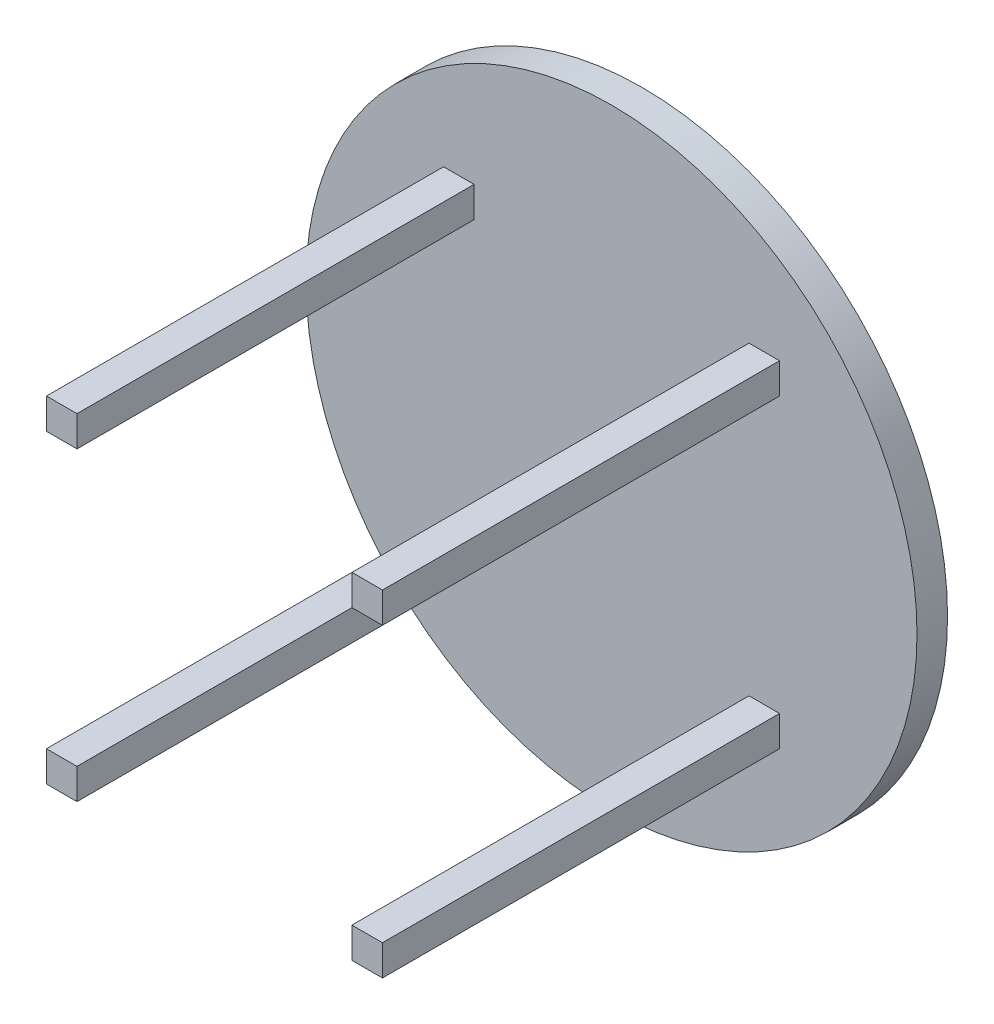
ISO-10303-21;
HEADER;
FILE_DESCRIPTION(('STEP AP214'),'2;1');
FILE_NAME('part.step','',(''),(''),'','','');
FILE_SCHEMA(('AUTOMOTIVE_DESIGN { 1 0 10303 214 1 1 1 1 }'));
ENDSEC;
DATA;
#1=APPLICATION_CONTEXT('core data for automotive mechanical design processes');
#2=APPLICATION_PROTOCOL_DEFINITION('international standard','automotive_design',2000,#1);
#3=PRODUCT_CONTEXT('',#1,'mechanical');
#4=PRODUCT('Part','Part','',(#3));
#5=PRODUCT_RELATED_PRODUCT_CATEGORY('part','',(#4));
#6=PRODUCT_DEFINITION_FORMATION('','',#4);
#7=PRODUCT_DEFINITION_CONTEXT('part definition',#1,'design');
#8=PRODUCT_DEFINITION('design','',#6,#7);
#9=PRODUCT_DEFINITION_SHAPE('','',#8);
#10=(LENGTH_UNIT() NAMED_UNIT(*) SI_UNIT(.MILLI.,.METRE.));
#11=(NAMED_UNIT(*) PLANE_ANGLE_UNIT() SI_UNIT($,.RADIAN.));
#12=(NAMED_UNIT(*) SI_UNIT($,.STERADIAN.) SOLID_ANGLE_UNIT());
#13=UNCERTAINTY_MEASURE_WITH_UNIT(LENGTH_MEASURE(1.E-05),#10,'distance_accuracy_value','');
#14=(GEOMETRIC_REPRESENTATION_CONTEXT(3) GLOBAL_UNCERTAINTY_ASSIGNED_CONTEXT((#13)) GLOBAL_UNIT_ASSIGNED_CONTEXT((#10,
#11,#12)) REPRESENTATION_CONTEXT('',''));
#15=CARTESIAN_POINT('',(0.,0.,0.));
#16=DIRECTION('',(0.,0.,1.));
#17=DIRECTION('',(1.,0.,0.));
#18=AXIS2_PLACEMENT_3D('',#15,#16,#17);
#19=CARTESIAN_POINT('',(0.,275.,0.));
#20=DIRECTION('',(0.,-1.,0.));
#21=DIRECTION('',(0.,0.,-1.));
#22=AXIS2_PLACEMENT_3D('',#19,#20,#21);
#23=PLANE('',#22);
#24=DIRECTION('',(1.,0.,0.));
#25=VECTOR('',#24,1.);
#26=CARTESIAN_POINT('',(0.,275.,0.));
#27=LINE('',#26,#25);
#28=CARTESIAN_POINT('',(75.,275.,0.));
#29=VERTEX_POINT('',#28);
#30=CARTESIAN_POINT('',(100.,275.,0.));
#31=VERTEX_POINT('',#30);
#32=EDGE_CURVE('E64',#29,#31,#27,.T.);
#33=ORIENTED_EDGE('',*,*,#32,.F.);
#34=DIRECTION('',(0.,0.,-1.));
#35=VECTOR('',#34,1.);
#36=CARTESIAN_POINT('',(75.,275.,0.));
#37=LINE('',#36,#35);
#38=CARTESIAN_POINT('',(75.,275.,-25.));
#39=VERTEX_POINT('',#38);
#40=EDGE_CURVE('E11',#29,#39,#37,.T.);
#41=ORIENTED_EDGE('',*,*,#40,.T.);
#42=DIRECTION('',(-1.,0.,0.));
#43=VECTOR('',#42,1.);
#44=CARTESIAN_POINT('',(-75.,275.,-25.));
#45=LINE('',#44,#43);
#46=CARTESIAN_POINT('',(-75.,275.,-25.));
#47=VERTEX_POINT('',#46);
#48=EDGE_CURVE('E233',#39,#47,#45,.T.);
#49=ORIENTED_EDGE('',*,*,#48,.T.);
#50=DIRECTION('',(0.,0.,1.));
#51=VECTOR('',#50,1.);
#52=CARTESIAN_POINT('',(-75.,275.,25.));
#53=LINE('',#52,#51);
#54=CARTESIAN_POINT('',(-75.,275.,0.));
#55=VERTEX_POINT('',#54);
#56=EDGE_CURVE('E779',#47,#55,#53,.T.);
#57=ORIENTED_EDGE('',*,*,#56,.T.);
#58=CARTESIAN_POINT('',(-100.,275.,0.));
#59=VERTEX_POINT('',#58);
#60=EDGE_CURVE('E394',#59,#55,#27,.T.);
#61=ORIENTED_EDGE('',*,*,#60,.F.);
#62=DIRECTION('',(0.,0.,1.));
#63=VECTOR('',#62,1.);
#64=CARTESIAN_POINT('',(-100.,275.,50.));
#65=LINE('',#64,#63);
#66=CARTESIAN_POINT('',(-100.,275.,-50.));
#67=VERTEX_POINT('',#66);
#68=EDGE_CURVE('E246',#67,#59,#65,.T.);
#69=ORIENTED_EDGE('',*,*,#68,.F.);
#70=DIRECTION('',(-1.,0.,0.));
#71=VECTOR('',#70,1.);
#72=CARTESIAN_POINT('',(-100.,275.,-50.));
#73=LINE('',#72,#71);
#74=CARTESIAN_POINT('',(100.,275.,-50.));
#75=VERTEX_POINT('',#74);
#76=EDGE_CURVE('E237',#75,#67,#73,.T.);
#77=ORIENTED_EDGE('',*,*,#76,.F.);
#78=DIRECTION('',(0.,0.,-1.));
#79=VECTOR('',#78,1.);
#80=CARTESIAN_POINT('',(100.,275.,50.));
#81=LINE('',#80,#79);
#82=EDGE_CURVE('E234',#31,#75,#81,.T.);
#83=ORIENTED_EDGE('',*,*,#82,.F.);
#84=EDGE_LOOP('',(#33,#41,#49,#57,#61,#69,#77,#83));
#85=FACE_BOUND('',#84,.T.);
#86=ADVANCED_FACE('F41',(#85),#23,.T.);
#87=CARTESIAN_POINT('',(0.,0.,0.));
#88=DIRECTION('',(0.,0.,1.));
#89=DIRECTION('',(1.,0.,0.));
#90=AXIS2_PLACEMENT_3D('',#87,#88,#89);
#91=PLANE('',#90);
#92=CARTESIAN_POINT('',(0.,0.,0.));
#93=DIRECTION('',(0.,0.,1.));
#94=DIRECTION('',(1.,0.,0.));
#95=AXIS2_PLACEMENT_3D('',#92,#93,#94);
#96=CIRCLE('',#95,500.);
#97=CARTESIAN_POINT('',(500.,0.,0.));
#98=VERTEX_POINT('',#97);
#99=EDGE_CURVE('E388',#98,#98,#96,.T.);
#100=ORIENTED_EDGE('',*,*,#99,.F.);
#101=EDGE_LOOP('',(#100));
#102=FACE_BOUND('',#101,.T.);
#103=DIRECTION('',(1.,0.,0.));
#104=VECTOR('',#103,1.);
#105=CARTESIAN_POINT('',(0.,325.,0.));
#106=LINE('',#105,#104);
#107=CARTESIAN_POINT('',(-100.,325.,0.));
#108=VERTEX_POINT('',#107);
#109=CARTESIAN_POINT('',(100.,325.,0.));
#110=VERTEX_POINT('',#109);
#111=EDGE_CURVE('E49',#108,#110,#106,.T.);
#112=ORIENTED_EDGE('',*,*,#111,.F.);
#113=DIRECTION('',(0.,1.,0.));
#114=VECTOR('',#113,1.);
#115=CARTESIAN_POINT('',(-100.,0.,0.));
#116=LINE('',#115,#114);
#117=EDGE_CURVE('E397',#59,#108,#116,.T.);
#118=ORIENTED_EDGE('',*,*,#117,.F.);
#119=ORIENTED_EDGE('',*,*,#60,.T.);
#120=EDGE_CURVE('E398',#55,#29,#27,.T.);
#121=ORIENTED_EDGE('',*,*,#120,.T.);
#122=ORIENTED_EDGE('',*,*,#32,.T.);
#123=DIRECTION('',(0.,-1.,0.));
#124=VECTOR('',#123,1.);
#125=CARTESIAN_POINT('',(100.,0.,0.));
#126=LINE('',#125,#124);
#127=EDGE_CURVE('E400',#110,#31,#126,.T.);
#128=ORIENTED_EDGE('',*,*,#127,.F.);
#129=EDGE_LOOP('',(#112,#118,#119,#121,#122,#128));
#130=FACE_BOUND('',#129,.T.);
#131=ADVANCED_FACE('F412',(#102,#130),#91,.F.);
#132=CARTESIAN_POINT('',(0.,0.,50.));
#133=DIRECTION('',(0.,0.,1.));
#134=DIRECTION('',(1.,0.,0.));
#135=AXIS2_PLACEMENT_3D('',#132,#133,#134);
#136=PLANE('',#135);
#137=CARTESIAN_POINT('',(0.,0.,50.));
#138=DIRECTION('',(0.,0.,1.));
#139=DIRECTION('',(1.,0.,0.));
#140=AXIS2_PLACEMENT_3D('',#137,#138,#139);
#141=CIRCLE('',#140,500.);
#142=CARTESIAN_POINT('',(500.,0.,50.));
#143=VERTEX_POINT('',#142);
#144=EDGE_CURVE('E389',#143,#143,#141,.T.);
#145=ORIENTED_EDGE('',*,*,#144,.T.);
#146=EDGE_LOOP('',(#145));
#147=FACE_BOUND('',#146,.T.);
#148=DIRECTION('',(1.,0.,0.));
#149=VECTOR('',#148,1.);
#150=CARTESIAN_POINT('',(0.,275.,50.));
#151=LINE('',#150,#149);
#152=CARTESIAN_POINT('',(225.,275.,50.));
#153=VERTEX_POINT('',#152);
#154=CARTESIAN_POINT('',(275.,275.,50.));
#155=VERTEX_POINT('',#154);
#156=EDGE_CURVE('E382',#153,#155,#151,.T.);
#157=ORIENTED_EDGE('',*,*,#156,.T.);
#158=DIRECTION('',(0.,-1.,0.));
#159=VECTOR('',#158,1.);
#160=CARTESIAN_POINT('',(275.,0.,50.));
#161=LINE('',#160,#159);
#162=CARTESIAN_POINT('',(275.,225.,50.));
#163=VERTEX_POINT('',#162);
#164=EDGE_CURVE('E385',#155,#163,#161,.T.);
#165=ORIENTED_EDGE('',*,*,#164,.T.);
#166=DIRECTION('',(-1.,0.,0.));
#167=VECTOR('',#166,1.);
#168=CARTESIAN_POINT('',(0.,225.,50.));
#169=LINE('',#168,#167);
#170=CARTESIAN_POINT('',(225.,225.,50.));
#171=VERTEX_POINT('',#170);
#172=EDGE_CURVE('E376',#163,#171,#169,.T.);
#173=ORIENTED_EDGE('',*,*,#172,.T.);
#174=DIRECTION('',(0.,1.,0.));
#175=VECTOR('',#174,1.);
#176=CARTESIAN_POINT('',(225.,0.,50.));
#177=LINE('',#176,#175);
#178=EDGE_CURVE('E379',#171,#153,#177,.T.);
#179=ORIENTED_EDGE('',*,*,#178,.T.);
#180=EDGE_LOOP('',(#157,#165,#173,#179));
#181=FACE_BOUND('',#180,.T.);
#182=DIRECTION('',(1.,0.,0.));
#183=VECTOR('',#182,1.);
#184=CARTESIAN_POINT('',(0.,275.,50.));
#185=LINE('',#184,#183);
#186=CARTESIAN_POINT('',(-275.,275.,50.));
#187=VERTEX_POINT('',#186);
#188=CARTESIAN_POINT('',(-225.,275.,50.));
#189=VERTEX_POINT('',#188);
#190=EDGE_CURVE('E350',#187,#189,#185,.T.);
#191=ORIENTED_EDGE('',*,*,#190,.T.);
#192=DIRECTION('',(0.,-1.,0.));
#193=VECTOR('',#192,1.);
#194=CARTESIAN_POINT('',(-225.,0.,50.));
#195=LINE('',#194,#193);
#196=CARTESIAN_POINT('',(-225.,225.,50.));
#197=VERTEX_POINT('',#196);
#198=EDGE_CURVE('E353',#189,#197,#195,.T.);
#199=ORIENTED_EDGE('',*,*,#198,.T.);
#200=DIRECTION('',(-1.,0.,0.));
#201=VECTOR('',#200,1.);
#202=CARTESIAN_POINT('',(0.,225.,50.));
#203=LINE('',#202,#201);
#204=CARTESIAN_POINT('',(-275.,225.,50.));
#205=VERTEX_POINT('',#204);
#206=EDGE_CURVE('E344',#197,#205,#203,.T.);
#207=ORIENTED_EDGE('',*,*,#206,.T.);
#208=DIRECTION('',(0.,1.,0.));
#209=VECTOR('',#208,1.);
#210=CARTESIAN_POINT('',(-275.,0.,50.));
#211=LINE('',#210,#209);
#212=EDGE_CURVE('E347',#205,#187,#211,.T.);
#213=ORIENTED_EDGE('',*,*,#212,.T.);
#214=EDGE_LOOP('',(#191,#199,#207,#213));
#215=FACE_BOUND('',#214,.T.);
#216=DIRECTION('',(1.,0.,0.));
#217=VECTOR('',#216,1.);
#218=CARTESIAN_POINT('',(0.,-225.,50.));
#219=LINE('',#218,#217);
#220=CARTESIAN_POINT('',(225.,-225.,50.));
#221=VERTEX_POINT('',#220);
#222=CARTESIAN_POINT('',(275.,-225.,50.));
#223=VERTEX_POINT('',#222);
#224=EDGE_CURVE('E318',#221,#223,#219,.T.);
#225=ORIENTED_EDGE('',*,*,#224,.T.);
#226=DIRECTION('',(0.,-1.,0.));
#227=VECTOR('',#226,1.);
#228=CARTESIAN_POINT('',(275.,0.,50.));
#229=LINE('',#228,#227);
#230=CARTESIAN_POINT('',(275.,-275.,50.));
#231=VERTEX_POINT('',#230);
#232=EDGE_CURVE('E321',#223,#231,#229,.T.);
#233=ORIENTED_EDGE('',*,*,#232,.T.);
#234=DIRECTION('',(-1.,0.,0.));
#235=VECTOR('',#234,1.);
#236=CARTESIAN_POINT('',(0.,-275.,50.));
#237=LINE('',#236,#235);
#238=CARTESIAN_POINT('',(225.,-275.,50.));
#239=VERTEX_POINT('',#238);
#240=EDGE_CURVE('E312',#231,#239,#237,.T.);
#241=ORIENTED_EDGE('',*,*,#240,.T.);
#242=DIRECTION('',(0.,1.,0.));
#243=VECTOR('',#242,1.);
#244=CARTESIAN_POINT('',(225.,0.,50.));
#245=LINE('',#244,#243);
#246=EDGE_CURVE('E315',#239,#221,#245,.T.);
#247=ORIENTED_EDGE('',*,*,#246,.T.);
#248=EDGE_LOOP('',(#225,#233,#241,#247));
#249=FACE_BOUND('',#248,.T.);
#250=DIRECTION('',(1.,0.,0.));
#251=VECTOR('',#250,1.);
#252=CARTESIAN_POINT('',(0.,-225.,50.));
#253=LINE('',#252,#251);
#254=CARTESIAN_POINT('',(-275.,-225.,50.));
#255=VERTEX_POINT('',#254);
#256=CARTESIAN_POINT('',(-225.,-225.,50.));
#257=VERTEX_POINT('',#256);
#258=EDGE_CURVE('E286',#255,#257,#253,.T.);
#259=ORIENTED_EDGE('',*,*,#258,.T.);
#260=DIRECTION('',(0.,-1.,0.));
#261=VECTOR('',#260,1.);
#262=CARTESIAN_POINT('',(-225.,0.,50.));
#263=LINE('',#262,#261);
#264=CARTESIAN_POINT('',(-225.,-275.,50.));
#265=VERTEX_POINT('',#264);
#266=EDGE_CURVE('E289',#257,#265,#263,.T.);
#267=ORIENTED_EDGE('',*,*,#266,.T.);
#268=DIRECTION('',(-1.,0.,0.));
#269=VECTOR('',#268,1.);
#270=CARTESIAN_POINT('',(0.,-275.,50.));
#271=LINE('',#270,#269);
#272=CARTESIAN_POINT('',(-275.,-275.,50.));
#273=VERTEX_POINT('',#272);
#274=EDGE_CURVE('E280',#265,#273,#271,.T.);
#275=ORIENTED_EDGE('',*,*,#274,.T.);
#276=DIRECTION('',(0.,1.,0.));
#277=VECTOR('',#276,1.);
#278=CARTESIAN_POINT('',(-275.,0.,50.));
#279=LINE('',#278,#277);
#280=EDGE_CURVE('E283',#273,#255,#279,.T.);
#281=ORIENTED_EDGE('',*,*,#280,.T.);
#282=EDGE_LOOP('',(#259,#267,#275,#281));
#283=FACE_BOUND('',#282,.T.);
#284=ADVANCED_FACE('F414',(#147,#181,#215,#249,#283),#136,.T.);
#285=CARTESIAN_POINT('',(0.,0.,50.));
#286=DIRECTION('',(0.,0.,-1.));
#287=DIRECTION('',(-1.,0.,0.));
#288=AXIS2_PLACEMENT_3D('',#285,#286,#287);
#289=CYLINDRICAL_SURFACE('',#288,500.);
#290=ORIENTED_EDGE('',*,*,#144,.F.);
#291=EDGE_LOOP('',(#290));
#292=FACE_BOUND('',#291,.T.);
#293=ORIENTED_EDGE('',*,*,#99,.T.);
#294=EDGE_LOOP('',(#293));
#295=FACE_BOUND('',#294,.T.);
#296=ADVANCED_FACE('F43',(#292,#295),#289,.T.);
#297=CARTESIAN_POINT('',(275.,225.,700.));
#298=DIRECTION('',(-1.,0.,0.));
#299=DIRECTION('',(0.,0.,1.));
#300=AXIS2_PLACEMENT_3D('',#297,#298,#299);
#301=PLANE('',#300);
#302=ORIENTED_EDGE('',*,*,#164,.F.);
#303=DIRECTION('',(0.,0.,-1.));
#304=VECTOR('',#303,1.);
#305=CARTESIAN_POINT('',(275.,275.,700.));
#306=LINE('',#305,#304);
#307=CARTESIAN_POINT('',(275.,275.,700.));
#308=VERTEX_POINT('',#307);
#309=EDGE_CURVE('E373',#308,#155,#306,.T.);
#310=ORIENTED_EDGE('',*,*,#309,.F.);
#311=DIRECTION('',(0.,1.,0.));
#312=VECTOR('',#311,1.);
#313=CARTESIAN_POINT('',(275.,225.,700.));
#314=LINE('',#313,#312);
#315=CARTESIAN_POINT('',(275.,225.,700.));
#316=VERTEX_POINT('',#315);
#317=EDGE_CURVE('E356',#316,#308,#314,.T.);
#318=ORIENTED_EDGE('',*,*,#317,.F.);
#319=DIRECTION('',(0.,0.,-1.));
#320=VECTOR('',#319,1.);
#321=CARTESIAN_POINT('',(275.,225.,700.));
#322=LINE('',#321,#320);
#323=EDGE_CURVE('E365',#316,#163,#322,.T.);
#324=ORIENTED_EDGE('',*,*,#323,.T.);
#325=EDGE_LOOP('',(#302,#310,#318,#324));
#326=FACE_BOUND('',#325,.T.);
#327=ADVANCED_FACE('F427',(#326),#301,.F.);
#328=CARTESIAN_POINT('',(225.,275.,700.));
#329=DIRECTION('',(0.,-1.,0.));
#330=DIRECTION('',(0.,0.,-1.));
#331=AXIS2_PLACEMENT_3D('',#328,#329,#330);
#332=PLANE('',#331);
#333=ORIENTED_EDGE('',*,*,#156,.F.);
#334=DIRECTION('',(0.,0.,-1.));
#335=VECTOR('',#334,1.);
#336=CARTESIAN_POINT('',(225.,275.,700.));
#337=LINE('',#336,#335);
#338=CARTESIAN_POINT('',(225.,275.,700.));
#339=VERTEX_POINT('',#338);
#340=EDGE_CURVE('E370',#339,#153,#337,.T.);
#341=ORIENTED_EDGE('',*,*,#340,.F.);
#342=DIRECTION('',(-1.,0.,0.));
#343=VECTOR('',#342,1.);
#344=CARTESIAN_POINT('',(225.,275.,700.));
#345=LINE('',#344,#343);
#346=EDGE_CURVE('E359',#308,#339,#345,.T.);
#347=ORIENTED_EDGE('',*,*,#346,.F.);
#348=ORIENTED_EDGE('',*,*,#309,.T.);
#349=EDGE_LOOP('',(#333,#341,#347,#348));
#350=FACE_BOUND('',#349,.T.);
#351=ADVANCED_FACE('F430',(#350),#332,.F.);
#352=CARTESIAN_POINT('',(225.,225.,700.));
#353=DIRECTION('',(1.,0.,0.));
#354=DIRECTION('',(0.,0.,-1.));
#355=AXIS2_PLACEMENT_3D('',#352,#353,#354);
#356=PLANE('',#355);
#357=ORIENTED_EDGE('',*,*,#178,.F.);
#358=DIRECTION('',(0.,0.,-1.));
#359=VECTOR('',#358,1.);
#360=CARTESIAN_POINT('',(225.,225.,700.));
#361=LINE('',#360,#359);
#362=CARTESIAN_POINT('',(225.,225.,700.));
#363=VERTEX_POINT('',#362);
#364=EDGE_CURVE('E368',#363,#171,#361,.T.);
#365=ORIENTED_EDGE('',*,*,#364,.F.);
#366=DIRECTION('',(0.,-1.,0.));
#367=VECTOR('',#366,1.);
#368=CARTESIAN_POINT('',(225.,225.,700.));
#369=LINE('',#368,#367);
#370=EDGE_CURVE('E361',#339,#363,#369,.T.);
#371=ORIENTED_EDGE('',*,*,#370,.F.);
#372=ORIENTED_EDGE('',*,*,#340,.T.);
#373=EDGE_LOOP('',(#357,#365,#371,#372));
#374=FACE_BOUND('',#373,.T.);
#375=ADVANCED_FACE('F434',(#374),#356,.F.);
#376=CARTESIAN_POINT('',(225.,225.,700.));
#377=DIRECTION('',(0.,1.,0.));
#378=DIRECTION('',(0.,0.,1.));
#379=AXIS2_PLACEMENT_3D('',#376,#377,#378);
#380=PLANE('',#379);
#381=ORIENTED_EDGE('',*,*,#172,.F.);
#382=ORIENTED_EDGE('',*,*,#323,.F.);
#383=DIRECTION('',(1.,0.,0.));
#384=VECTOR('',#383,1.);
#385=CARTESIAN_POINT('',(225.,225.,700.));
#386=LINE('',#385,#384);
#387=EDGE_CURVE('E363',#363,#316,#386,.T.);
#388=ORIENTED_EDGE('',*,*,#387,.F.);
#389=ORIENTED_EDGE('',*,*,#364,.T.);
#390=EDGE_LOOP('',(#381,#382,#388,#389));
#391=FACE_BOUND('',#390,.T.);
#392=ADVANCED_FACE('F438',(#391),#380,.F.);
#393=CARTESIAN_POINT('',(0.,0.,700.));
#394=DIRECTION('',(0.,0.,-1.));
#395=DIRECTION('',(-1.,0.,0.));
#396=AXIS2_PLACEMENT_3D('',#393,#394,#395);
#397=PLANE('',#396);
#398=ORIENTED_EDGE('',*,*,#317,.T.);
#399=ORIENTED_EDGE('',*,*,#346,.T.);
#400=ORIENTED_EDGE('',*,*,#370,.T.);
#401=ORIENTED_EDGE('',*,*,#387,.T.);
#402=EDGE_LOOP('',(#398,#399,#400,#401));
#403=FACE_BOUND('',#402,.T.);
#404=ADVANCED_FACE('F442',(#403),#397,.F.);
#405=CARTESIAN_POINT('',(-225.,225.,700.));
#406=DIRECTION('',(-1.,0.,0.));
#407=DIRECTION('',(0.,0.,1.));
#408=AXIS2_PLACEMENT_3D('',#405,#406,#407);
#409=PLANE('',#408);
#410=ORIENTED_EDGE('',*,*,#198,.F.);
#411=DIRECTION('',(0.,0.,-1.));
#412=VECTOR('',#411,1.);
#413=CARTESIAN_POINT('',(-225.,275.,700.));
#414=LINE('',#413,#412);
#415=CARTESIAN_POINT('',(-225.,275.,700.));
#416=VERTEX_POINT('',#415);
#417=EDGE_CURVE('E341',#416,#189,#414,.T.);
#418=ORIENTED_EDGE('',*,*,#417,.F.);
#419=DIRECTION('',(0.,1.,0.));
#420=VECTOR('',#419,1.);
#421=CARTESIAN_POINT('',(-225.,225.,700.));
#422=LINE('',#421,#420);
#423=CARTESIAN_POINT('',(-225.,225.,700.));
#424=VERTEX_POINT('',#423);
#425=EDGE_CURVE('E324',#424,#416,#422,.T.);
#426=ORIENTED_EDGE('',*,*,#425,.F.);
#427=DIRECTION('',(0.,0.,-1.));
#428=VECTOR('',#427,1.);
#429=CARTESIAN_POINT('',(-225.,225.,700.));
#430=LINE('',#429,#428);
#431=EDGE_CURVE('E333',#424,#197,#430,.T.);
#432=ORIENTED_EDGE('',*,*,#431,.T.);
#433=EDGE_LOOP('',(#410,#418,#426,#432));
#434=FACE_BOUND('',#433,.T.);
#435=ADVANCED_FACE('F446',(#434),#409,.F.);
#436=CARTESIAN_POINT('',(-275.,275.,700.));
#437=DIRECTION('',(0.,-1.,0.));
#438=DIRECTION('',(0.,0.,-1.));
#439=AXIS2_PLACEMENT_3D('',#436,#437,#438);
#440=PLANE('',#439);
#441=ORIENTED_EDGE('',*,*,#190,.F.);
#442=DIRECTION('',(0.,0.,-1.));
#443=VECTOR('',#442,1.);
#444=CARTESIAN_POINT('',(-275.,275.,700.));
#445=LINE('',#444,#443);
#446=CARTESIAN_POINT('',(-275.,275.,700.));
#447=VERTEX_POINT('',#446);
#448=EDGE_CURVE('E338',#447,#187,#445,.T.);
#449=ORIENTED_EDGE('',*,*,#448,.F.);
#450=DIRECTION('',(-1.,0.,0.));
#451=VECTOR('',#450,1.);
#452=CARTESIAN_POINT('',(-275.,275.,700.));
#453=LINE('',#452,#451);
#454=EDGE_CURVE('E327',#416,#447,#453,.T.);
#455=ORIENTED_EDGE('',*,*,#454,.F.);
#456=ORIENTED_EDGE('',*,*,#417,.T.);
#457=EDGE_LOOP('',(#441,#449,#455,#456));
#458=FACE_BOUND('',#457,.T.);
#459=ADVANCED_FACE('F450',(#458),#440,.F.);
#460=CARTESIAN_POINT('',(-275.,225.,700.));
#461=DIRECTION('',(1.,0.,0.));
#462=DIRECTION('',(0.,0.,-1.));
#463=AXIS2_PLACEMENT_3D('',#460,#461,#462);
#464=PLANE('',#463);
#465=ORIENTED_EDGE('',*,*,#212,.F.);
#466=DIRECTION('',(0.,0.,-1.));
#467=VECTOR('',#466,1.);
#468=CARTESIAN_POINT('',(-275.,225.,700.));
#469=LINE('',#468,#467);
#470=CARTESIAN_POINT('',(-275.,225.,700.));
#471=VERTEX_POINT('',#470);
#472=EDGE_CURVE('E336',#471,#205,#469,.T.);
#473=ORIENTED_EDGE('',*,*,#472,.F.);
#474=DIRECTION('',(0.,-1.,0.));
#475=VECTOR('',#474,1.);
#476=CARTESIAN_POINT('',(-275.,225.,700.));
#477=LINE('',#476,#475);
#478=EDGE_CURVE('E329',#447,#471,#477,.T.);
#479=ORIENTED_EDGE('',*,*,#478,.F.);
#480=ORIENTED_EDGE('',*,*,#448,.T.);
#481=EDGE_LOOP('',(#465,#473,#479,#480));
#482=FACE_BOUND('',#481,.T.);
#483=ADVANCED_FACE('F454',(#482),#464,.F.);
#484=CARTESIAN_POINT('',(-275.,225.,700.));
#485=DIRECTION('',(0.,1.,0.));
#486=DIRECTION('',(0.,0.,1.));
#487=AXIS2_PLACEMENT_3D('',#484,#485,#486);
#488=PLANE('',#487);
#489=ORIENTED_EDGE('',*,*,#206,.F.);
#490=ORIENTED_EDGE('',*,*,#431,.F.);
#491=DIRECTION('',(1.,0.,0.));
#492=VECTOR('',#491,1.);
#493=CARTESIAN_POINT('',(-275.,225.,700.));
#494=LINE('',#493,#492);
#495=EDGE_CURVE('E331',#471,#424,#494,.T.);
#496=ORIENTED_EDGE('',*,*,#495,.F.);
#497=ORIENTED_EDGE('',*,*,#472,.T.);
#498=EDGE_LOOP('',(#489,#490,#496,#497));
#499=FACE_BOUND('',#498,.T.);
#500=ADVANCED_FACE('F458',(#499),#488,.F.);
#501=CARTESIAN_POINT('',(0.,0.,700.));
#502=DIRECTION('',(0.,0.,-1.));
#503=DIRECTION('',(-1.,0.,0.));
#504=AXIS2_PLACEMENT_3D('',#501,#502,#503);
#505=PLANE('',#504);
#506=ORIENTED_EDGE('',*,*,#425,.T.);
#507=ORIENTED_EDGE('',*,*,#454,.T.);
#508=ORIENTED_EDGE('',*,*,#478,.T.);
#509=ORIENTED_EDGE('',*,*,#495,.T.);
#510=EDGE_LOOP('',(#506,#507,#508,#509));
#511=FACE_BOUND('',#510,.T.);
#512=ADVANCED_FACE('F462',(#511),#505,.F.);
#513=CARTESIAN_POINT('',(275.,-275.,700.));
#514=DIRECTION('',(-1.,0.,0.));
#515=DIRECTION('',(0.,0.,1.));
#516=AXIS2_PLACEMENT_3D('',#513,#514,#515);
#517=PLANE('',#516);
#518=ORIENTED_EDGE('',*,*,#232,.F.);
#519=DIRECTION('',(0.,0.,-1.));
#520=VECTOR('',#519,1.);
#521=CARTESIAN_POINT('',(275.,-225.,700.));
#522=LINE('',#521,#520);
#523=CARTESIAN_POINT('',(275.,-225.,700.));
#524=VERTEX_POINT('',#523);
#525=EDGE_CURVE('E309',#524,#223,#522,.T.);
#526=ORIENTED_EDGE('',*,*,#525,.F.);
#527=DIRECTION('',(0.,1.,0.));
#528=VECTOR('',#527,1.);
#529=CARTESIAN_POINT('',(275.,-275.,700.));
#530=LINE('',#529,#528);
#531=CARTESIAN_POINT('',(275.,-275.,700.));
#532=VERTEX_POINT('',#531);
#533=EDGE_CURVE('E292',#532,#524,#530,.T.);
#534=ORIENTED_EDGE('',*,*,#533,.F.);
#535=DIRECTION('',(0.,0.,-1.));
#536=VECTOR('',#535,1.);
#537=CARTESIAN_POINT('',(275.,-275.,700.));
#538=LINE('',#537,#536);
#539=EDGE_CURVE('E301',#532,#231,#538,.T.);
#540=ORIENTED_EDGE('',*,*,#539,.T.);
#541=EDGE_LOOP('',(#518,#526,#534,#540));
#542=FACE_BOUND('',#541,.T.);
#543=ADVANCED_FACE('F466',(#542),#517,.F.);
#544=CARTESIAN_POINT('',(225.,-225.,700.));
#545=DIRECTION('',(0.,-1.,0.));
#546=DIRECTION('',(0.,0.,-1.));
#547=AXIS2_PLACEMENT_3D('',#544,#545,#546);
#548=PLANE('',#547);
#549=ORIENTED_EDGE('',*,*,#224,.F.);
#550=DIRECTION('',(0.,0.,-1.));
#551=VECTOR('',#550,1.);
#552=CARTESIAN_POINT('',(225.,-225.,700.));
#553=LINE('',#552,#551);
#554=CARTESIAN_POINT('',(225.,-225.,700.));
#555=VERTEX_POINT('',#554);
#556=EDGE_CURVE('E306',#555,#221,#553,.T.);
#557=ORIENTED_EDGE('',*,*,#556,.F.);
#558=DIRECTION('',(-1.,0.,0.));
#559=VECTOR('',#558,1.);
#560=CARTESIAN_POINT('',(225.,-225.,700.));
#561=LINE('',#560,#559);
#562=EDGE_CURVE('E295',#524,#555,#561,.T.);
#563=ORIENTED_EDGE('',*,*,#562,.F.);
#564=ORIENTED_EDGE('',*,*,#525,.T.);
#565=EDGE_LOOP('',(#549,#557,#563,#564));
#566=FACE_BOUND('',#565,.T.);
#567=ADVANCED_FACE('F470',(#566),#548,.F.);
#568=CARTESIAN_POINT('',(225.,-275.,700.));
#569=DIRECTION('',(1.,0.,0.));
#570=DIRECTION('',(0.,0.,-1.));
#571=AXIS2_PLACEMENT_3D('',#568,#569,#570);
#572=PLANE('',#571);
#573=ORIENTED_EDGE('',*,*,#246,.F.);
#574=DIRECTION('',(0.,0.,-1.));
#575=VECTOR('',#574,1.);
#576=CARTESIAN_POINT('',(225.,-275.,700.));
#577=LINE('',#576,#575);
#578=CARTESIAN_POINT('',(225.,-275.,700.));
#579=VERTEX_POINT('',#578);
#580=EDGE_CURVE('E304',#579,#239,#577,.T.);
#581=ORIENTED_EDGE('',*,*,#580,.F.);
#582=DIRECTION('',(0.,-1.,0.));
#583=VECTOR('',#582,1.);
#584=CARTESIAN_POINT('',(225.,-275.,700.));
#585=LINE('',#584,#583);
#586=EDGE_CURVE('E297',#555,#579,#585,.T.);
#587=ORIENTED_EDGE('',*,*,#586,.F.);
#588=ORIENTED_EDGE('',*,*,#556,.T.);
#589=EDGE_LOOP('',(#573,#581,#587,#588));
#590=FACE_BOUND('',#589,.T.);
#591=ADVANCED_FACE('F474',(#590),#572,.F.);
#592=CARTESIAN_POINT('',(225.,-275.,700.));
#593=DIRECTION('',(0.,1.,0.));
#594=DIRECTION('',(0.,0.,1.));
#595=AXIS2_PLACEMENT_3D('',#592,#593,#594);
#596=PLANE('',#595);
#597=ORIENTED_EDGE('',*,*,#240,.F.);
#598=ORIENTED_EDGE('',*,*,#539,.F.);
#599=DIRECTION('',(1.,0.,0.));
#600=VECTOR('',#599,1.);
#601=CARTESIAN_POINT('',(225.,-275.,700.));
#602=LINE('',#601,#600);
#603=EDGE_CURVE('E299',#579,#532,#602,.T.);
#604=ORIENTED_EDGE('',*,*,#603,.F.);
#605=ORIENTED_EDGE('',*,*,#580,.T.);
#606=EDGE_LOOP('',(#597,#598,#604,#605));
#607=FACE_BOUND('',#606,.T.);
#608=ADVANCED_FACE('F478',(#607),#596,.F.);
#609=CARTESIAN_POINT('',(0.,0.,700.));
#610=DIRECTION('',(0.,0.,-1.));
#611=DIRECTION('',(-1.,0.,0.));
#612=AXIS2_PLACEMENT_3D('',#609,#610,#611);
#613=PLANE('',#612);
#614=ORIENTED_EDGE('',*,*,#533,.T.);
#615=ORIENTED_EDGE('',*,*,#562,.T.);
#616=ORIENTED_EDGE('',*,*,#586,.T.);
#617=ORIENTED_EDGE('',*,*,#603,.T.);
#618=EDGE_LOOP('',(#614,#615,#616,#617));
#619=FACE_BOUND('',#618,.T.);
#620=ADVANCED_FACE('F482',(#619),#613,.F.);
#621=CARTESIAN_POINT('',(-225.,-275.,700.));
#622=DIRECTION('',(-1.,0.,0.));
#623=DIRECTION('',(0.,0.,1.));
#624=AXIS2_PLACEMENT_3D('',#621,#622,#623);
#625=PLANE('',#624);
#626=ORIENTED_EDGE('',*,*,#266,.F.);
#627=DIRECTION('',(0.,0.,-1.));
#628=VECTOR('',#627,1.);
#629=CARTESIAN_POINT('',(-225.,-225.,700.));
#630=LINE('',#629,#628);
#631=CARTESIAN_POINT('',(-225.,-225.,700.));
#632=VERTEX_POINT('',#631);
#633=EDGE_CURVE('E277',#632,#257,#630,.T.);
#634=ORIENTED_EDGE('',*,*,#633,.F.);
#635=DIRECTION('',(0.,1.,0.));
#636=VECTOR('',#635,1.);
#637=CARTESIAN_POINT('',(-225.,-275.,700.));
#638=LINE('',#637,#636);
#639=CARTESIAN_POINT('',(-225.,-275.,700.));
#640=VERTEX_POINT('',#639);
#641=EDGE_CURVE('E260',#640,#632,#638,.T.);
#642=ORIENTED_EDGE('',*,*,#641,.F.);
#643=DIRECTION('',(0.,0.,-1.));
#644=VECTOR('',#643,1.);
#645=CARTESIAN_POINT('',(-225.,-275.,700.));
#646=LINE('',#645,#644);
#647=EDGE_CURVE('E269',#640,#265,#646,.T.);
#648=ORIENTED_EDGE('',*,*,#647,.T.);
#649=EDGE_LOOP('',(#626,#634,#642,#648));
#650=FACE_BOUND('',#649,.T.);
#651=ADVANCED_FACE('F486',(#650),#625,.F.);
#652=CARTESIAN_POINT('',(-275.,-225.,700.));
#653=DIRECTION('',(0.,-1.,0.));
#654=DIRECTION('',(0.,0.,-1.));
#655=AXIS2_PLACEMENT_3D('',#652,#653,#654);
#656=PLANE('',#655);
#657=ORIENTED_EDGE('',*,*,#258,.F.);
#658=DIRECTION('',(0.,0.,-1.));
#659=VECTOR('',#658,1.);
#660=CARTESIAN_POINT('',(-275.,-225.,700.));
#661=LINE('',#660,#659);
#662=CARTESIAN_POINT('',(-275.,-225.,700.));
#663=VERTEX_POINT('',#662);
#664=EDGE_CURVE('E274',#663,#255,#661,.T.);
#665=ORIENTED_EDGE('',*,*,#664,.F.);
#666=DIRECTION('',(-1.,0.,0.));
#667=VECTOR('',#666,1.);
#668=CARTESIAN_POINT('',(-275.,-225.,700.));
#669=LINE('',#668,#667);
#670=EDGE_CURVE('E263',#632,#663,#669,.T.);
#671=ORIENTED_EDGE('',*,*,#670,.F.);
#672=ORIENTED_EDGE('',*,*,#633,.T.);
#673=EDGE_LOOP('',(#657,#665,#671,#672));
#674=FACE_BOUND('',#673,.T.);
#675=ADVANCED_FACE('F490',(#674),#656,.F.);
#676=CARTESIAN_POINT('',(-275.,-275.,700.));
#677=DIRECTION('',(1.,0.,0.));
#678=DIRECTION('',(0.,0.,-1.));
#679=AXIS2_PLACEMENT_3D('',#676,#677,#678);
#680=PLANE('',#679);
#681=ORIENTED_EDGE('',*,*,#280,.F.);
#682=DIRECTION('',(0.,0.,-1.));
#683=VECTOR('',#682,1.);
#684=CARTESIAN_POINT('',(-275.,-275.,700.));
#685=LINE('',#684,#683);
#686=CARTESIAN_POINT('',(-275.,-275.,700.));
#687=VERTEX_POINT('',#686);
#688=EDGE_CURVE('E272',#687,#273,#685,.T.);
#689=ORIENTED_EDGE('',*,*,#688,.F.);
#690=DIRECTION('',(0.,-1.,0.));
#691=VECTOR('',#690,1.);
#692=CARTESIAN_POINT('',(-275.,-275.,700.));
#693=LINE('',#692,#691);
#694=EDGE_CURVE('E265',#663,#687,#693,.T.);
#695=ORIENTED_EDGE('',*,*,#694,.F.);
#696=ORIENTED_EDGE('',*,*,#664,.T.);
#697=EDGE_LOOP('',(#681,#689,#695,#696));
#698=FACE_BOUND('',#697,.T.);
#699=ADVANCED_FACE('F494',(#698),#680,.F.);
#700=CARTESIAN_POINT('',(-275.,-275.,700.));
#701=DIRECTION('',(0.,1.,0.));
#702=DIRECTION('',(0.,0.,1.));
#703=AXIS2_PLACEMENT_3D('',#700,#701,#702);
#704=PLANE('',#703);
#705=ORIENTED_EDGE('',*,*,#274,.F.);
#706=ORIENTED_EDGE('',*,*,#647,.F.);
#707=DIRECTION('',(1.,0.,0.));
#708=VECTOR('',#707,1.);
#709=CARTESIAN_POINT('',(-275.,-275.,700.));
#710=LINE('',#709,#708);
#711=EDGE_CURVE('E267',#687,#640,#710,.T.);
#712=ORIENTED_EDGE('',*,*,#711,.F.);
#713=ORIENTED_EDGE('',*,*,#688,.T.);
#714=EDGE_LOOP('',(#705,#706,#712,#713));
#715=FACE_BOUND('',#714,.T.);
#716=ADVANCED_FACE('F498',(#715),#704,.F.);
#717=CARTESIAN_POINT('',(0.,0.,700.));
#718=DIRECTION('',(0.,0.,-1.));
#719=DIRECTION('',(-1.,0.,0.));
#720=AXIS2_PLACEMENT_3D('',#717,#718,#719);
#721=PLANE('',#720);
#722=ORIENTED_EDGE('',*,*,#641,.T.);
#723=ORIENTED_EDGE('',*,*,#670,.T.);
#724=ORIENTED_EDGE('',*,*,#694,.T.);
#725=ORIENTED_EDGE('',*,*,#711,.T.);
#726=EDGE_LOOP('',(#722,#723,#724,#725));
#727=FACE_BOUND('',#726,.T.);
#728=ADVANCED_FACE('F502',(#727),#721,.F.);
#729=CARTESIAN_POINT('',(100.,325.,50.));
#730=DIRECTION('',(-1.,0.,0.));
#731=DIRECTION('',(0.,0.,1.));
#732=AXIS2_PLACEMENT_3D('',#729,#730,#731);
#733=PLANE('',#732);
#734=DIRECTION('',(0.,0.,-1.));
#735=VECTOR('',#734,1.);
#736=CARTESIAN_POINT('',(100.,325.,50.));
#737=LINE('',#736,#735);
#738=CARTESIAN_POINT('',(100.,325.,-50.));
#739=VERTEX_POINT('',#738);
#740=EDGE_CURVE('E243',#110,#739,#737,.T.);
#741=ORIENTED_EDGE('',*,*,#740,.F.);
#742=ORIENTED_EDGE('',*,*,#127,.T.);
#743=ORIENTED_EDGE('',*,*,#82,.T.);
#744=DIRECTION('',(0.,-1.,0.));
#745=VECTOR('',#744,1.);
#746=CARTESIAN_POINT('',(100.,325.,-50.));
#747=LINE('',#746,#745);
#748=EDGE_CURVE('E257',#739,#75,#747,.T.);
#749=ORIENTED_EDGE('',*,*,#748,.F.);
#750=EDGE_LOOP('',(#741,#742,#743,#749));
#751=FACE_BOUND('',#750,.T.);
#752=ADVANCED_FACE('F411',(#751),#733,.F.);
#753=CARTESIAN_POINT('',(-100.,325.,50.));
#754=DIRECTION('',(1.,0.,0.));
#755=DIRECTION('',(0.,0.,-1.));
#756=AXIS2_PLACEMENT_3D('',#753,#754,#755);
#757=PLANE('',#756);
#758=ORIENTED_EDGE('',*,*,#68,.T.);
#759=ORIENTED_EDGE('',*,*,#117,.T.);
#760=DIRECTION('',(0.,0.,1.));
#761=VECTOR('',#760,1.);
#762=CARTESIAN_POINT('',(-100.,325.,50.));
#763=LINE('',#762,#761);
#764=CARTESIAN_POINT('',(-100.,325.,-50.));
#765=VERTEX_POINT('',#764);
#766=EDGE_CURVE('E248',#765,#108,#763,.T.);
#767=ORIENTED_EDGE('',*,*,#766,.F.);
#768=DIRECTION('',(0.,-1.,0.));
#769=VECTOR('',#768,1.);
#770=CARTESIAN_POINT('',(-100.,325.,-50.));
#771=LINE('',#770,#769);
#772=EDGE_CURVE('E250',#765,#67,#771,.T.);
#773=ORIENTED_EDGE('',*,*,#772,.T.);
#774=EDGE_LOOP('',(#758,#759,#767,#773));
#775=FACE_BOUND('',#774,.T.);
#776=ADVANCED_FACE('F509',(#775),#757,.F.);
#777=CARTESIAN_POINT('',(0.,325.,0.));
#778=DIRECTION('',(0.,-1.,0.));
#779=DIRECTION('',(0.,0.,-1.));
#780=AXIS2_PLACEMENT_3D('',#777,#778,#779);
#781=PLANE('',#780);
#782=ORIENTED_EDGE('',*,*,#766,.T.);
#783=ORIENTED_EDGE('',*,*,#111,.T.);
#784=ORIENTED_EDGE('',*,*,#740,.T.);
#785=DIRECTION('',(-1.,0.,0.));
#786=VECTOR('',#785,1.);
#787=CARTESIAN_POINT('',(-100.,325.,-50.));
#788=LINE('',#787,#786);
#789=EDGE_CURVE('E245',#739,#765,#788,.T.);
#790=ORIENTED_EDGE('',*,*,#789,.T.);
#791=EDGE_LOOP('',(#782,#783,#784,#790));
#792=FACE_BOUND('',#791,.T.);
#793=ADVANCED_FACE('F405',(#792),#781,.F.);
#794=CARTESIAN_POINT('',(-100.,325.,-50.));
#795=DIRECTION('',(0.,0.,1.));
#796=DIRECTION('',(1.,0.,0.));
#797=AXIS2_PLACEMENT_3D('',#794,#795,#796);
#798=PLANE('',#797);
#799=ORIENTED_EDGE('',*,*,#76,.T.);
#800=ORIENTED_EDGE('',*,*,#772,.F.);
#801=ORIENTED_EDGE('',*,*,#789,.F.);
#802=ORIENTED_EDGE('',*,*,#748,.T.);
#803=EDGE_LOOP('',(#799,#800,#801,#802));
#804=FACE_BOUND('',#803,.T.);
#805=ADVANCED_FACE('F510',(#804),#798,.F.);
#806=CARTESIAN_POINT('',(0.,275.,0.));
#807=DIRECTION('',(0.,-1.,0.));
#808=DIRECTION('',(0.,0.,-1.));
#809=AXIS2_PLACEMENT_3D('',#806,#807,#808);
#810=PLANE('',#809);
#811=CARTESIAN_POINT('',(-75.,275.,25.));
#812=VERTEX_POINT('',#811);
#813=EDGE_CURVE('E56',#55,#812,#53,.T.);
#814=ORIENTED_EDGE('',*,*,#813,.T.);
#815=DIRECTION('',(1.,0.,0.));
#816=VECTOR('',#815,1.);
#817=CARTESIAN_POINT('',(-75.,275.,25.));
#818=LINE('',#817,#816);
#819=CARTESIAN_POINT('',(75.,275.,25.));
#820=VERTEX_POINT('',#819);
#821=EDGE_CURVE('E229',#812,#820,#818,.T.);
#822=ORIENTED_EDGE('',*,*,#821,.T.);
#823=DIRECTION('',(0.,0.,-1.));
#824=VECTOR('',#823,1.);
#825=CARTESIAN_POINT('',(75.,275.,25.));
#826=LINE('',#825,#824);
#827=EDGE_CURVE('E789',#820,#29,#826,.T.);
#828=ORIENTED_EDGE('',*,*,#827,.T.);
#829=ORIENTED_EDGE('',*,*,#120,.F.);
#830=EDGE_LOOP('',(#814,#822,#828,#829));
#831=FACE_BOUND('',#830,.T.);
#832=ADVANCED_FACE('F513',(#831),#810,.F.);
#833=CARTESIAN_POINT('',(75.,305.,25.));
#834=DIRECTION('',(-1.,0.,0.));
#835=DIRECTION('',(0.,0.,1.));
#836=AXIS2_PLACEMENT_3D('',#833,#834,#835);
#837=PLANE('',#836);
#838=ORIENTED_EDGE('',*,*,#827,.F.);
#839=DIRECTION('',(0.,-1.,0.));
#840=VECTOR('',#839,1.);
#841=CARTESIAN_POINT('',(75.,305.,25.));
#842=LINE('',#841,#840);
#843=CARTESIAN_POINT('',(75.,305.,25.));
#844=VERTEX_POINT('',#843);
#845=EDGE_CURVE('E228',#844,#820,#842,.T.);
#846=ORIENTED_EDGE('',*,*,#845,.F.);
#847=DIRECTION('',(0.,0.,-1.));
#848=VECTOR('',#847,1.);
#849=CARTESIAN_POINT('',(75.,305.,25.));
#850=LINE('',#849,#848);
#851=CARTESIAN_POINT('',(75.,305.,-25.));
#852=VERTEX_POINT('',#851);
#853=EDGE_CURVE('E215',#844,#852,#850,.T.);
#854=ORIENTED_EDGE('',*,*,#853,.T.);
#855=DIRECTION('',(0.,-1.,0.));
#856=VECTOR('',#855,1.);
#857=CARTESIAN_POINT('',(75.,305.,-25.));
#858=LINE('',#857,#856);
#859=EDGE_CURVE('E226',#852,#39,#858,.T.);
#860=ORIENTED_EDGE('',*,*,#859,.T.);
#861=ORIENTED_EDGE('',*,*,#40,.F.);
#862=EDGE_LOOP('',(#838,#846,#854,#860,#861));
#863=FACE_BOUND('',#862,.T.);
#864=ADVANCED_FACE('F225',(#863),#837,.T.);
#865=CARTESIAN_POINT('',(-75.,305.,-25.));
#866=DIRECTION('',(0.,0.,1.));
#867=DIRECTION('',(1.,0.,0.));
#868=AXIS2_PLACEMENT_3D('',#865,#866,#867);
#869=PLANE('',#868);
#870=ORIENTED_EDGE('',*,*,#48,.F.);
#871=ORIENTED_EDGE('',*,*,#859,.F.);
#872=DIRECTION('',(-1.,0.,0.));
#873=VECTOR('',#872,1.);
#874=CARTESIAN_POINT('',(-75.,305.,-25.));
#875=LINE('',#874,#873);
#876=CARTESIAN_POINT('',(-75.,305.,-25.));
#877=VERTEX_POINT('',#876);
#878=EDGE_CURVE('E211',#852,#877,#875,.T.);
#879=ORIENTED_EDGE('',*,*,#878,.T.);
#880=DIRECTION('',(0.,-1.,0.));
#881=VECTOR('',#880,1.);
#882=CARTESIAN_POINT('',(-75.,305.,-25.));
#883=LINE('',#882,#881);
#884=EDGE_CURVE('E235',#877,#47,#883,.T.);
#885=ORIENTED_EDGE('',*,*,#884,.T.);
#886=EDGE_LOOP('',(#870,#871,#879,#885));
#887=FACE_BOUND('',#886,.T.);
#888=ADVANCED_FACE('F231',(#887),#869,.T.);
#889=CARTESIAN_POINT('',(-75.,305.,25.));
#890=DIRECTION('',(1.,0.,0.));
#891=DIRECTION('',(0.,0.,-1.));
#892=AXIS2_PLACEMENT_3D('',#889,#890,#891);
#893=PLANE('',#892);
#894=ORIENTED_EDGE('',*,*,#56,.F.);
#895=ORIENTED_EDGE('',*,*,#884,.F.);
#896=DIRECTION('',(0.,0.,1.));
#897=VECTOR('',#896,1.);
#898=CARTESIAN_POINT('',(-75.,305.,25.));
#899=LINE('',#898,#897);
#900=CARTESIAN_POINT('',(-75.,305.,25.));
#901=VERTEX_POINT('',#900);
#902=EDGE_CURVE('E216',#877,#901,#899,.T.);
#903=ORIENTED_EDGE('',*,*,#902,.T.);
#904=DIRECTION('',(0.,-1.,0.));
#905=VECTOR('',#904,1.);
#906=CARTESIAN_POINT('',(-75.,305.,25.));
#907=LINE('',#906,#905);
#908=EDGE_CURVE('E239',#901,#812,#907,.T.);
#909=ORIENTED_EDGE('',*,*,#908,.T.);
#910=ORIENTED_EDGE('',*,*,#813,.F.);
#911=EDGE_LOOP('',(#894,#895,#903,#909,#910));
#912=FACE_BOUND('',#911,.T.);
#913=ADVANCED_FACE('F524',(#912),#893,.T.);
#914=CARTESIAN_POINT('',(-75.,305.,25.));
#915=DIRECTION('',(0.,0.,-1.));
#916=DIRECTION('',(-1.,0.,0.));
#917=AXIS2_PLACEMENT_3D('',#914,#915,#916);
#918=PLANE('',#917);
#919=ORIENTED_EDGE('',*,*,#821,.F.);
#920=ORIENTED_EDGE('',*,*,#908,.F.);
#921=DIRECTION('',(1.,0.,0.));
#922=VECTOR('',#921,1.);
#923=CARTESIAN_POINT('',(-75.,305.,25.));
#924=LINE('',#923,#922);
#925=EDGE_CURVE('E785',#901,#844,#924,.T.);
#926=ORIENTED_EDGE('',*,*,#925,.T.);
#927=ORIENTED_EDGE('',*,*,#845,.T.);
#928=EDGE_LOOP('',(#919,#920,#926,#927));
#929=FACE_BOUND('',#928,.T.);
#930=ADVANCED_FACE('F527',(#929),#918,.T.);
#931=CARTESIAN_POINT('',(0.,305.,0.));
#932=DIRECTION('',(0.,-1.,0.));
#933=DIRECTION('',(0.,0.,-1.));
#934=AXIS2_PLACEMENT_3D('',#931,#932,#933);
#935=PLANE('',#934);
#936=ORIENTED_EDGE('',*,*,#853,.F.);
#937=ORIENTED_EDGE('',*,*,#925,.F.);
#938=ORIENTED_EDGE('',*,*,#902,.F.);
#939=ORIENTED_EDGE('',*,*,#878,.F.);
#940=EDGE_LOOP('',(#936,#937,#938,#939));
#941=FACE_BOUND('',#940,.T.);
#942=ADVANCED_FACE('F213',(#941),#935,.T.);
#943=CLOSED_SHELL('',(#86,#131,#284,#296,#327,#351,#375,#392,#404,#435,#459,#483,#500,#512,#543,
#567,#591,#608,#620,#651,#675,#699,#716,#728,#752,#776,#793,#805,#832,#864,#888,#913,#930,#942));
#944=MANIFOLD_SOLID_BREP('B2',#943);
#945=ADVANCED_BREP_SHAPE_REPRESENTATION('',(#18,#944),#14);
#946=SHAPE_DEFINITION_REPRESENTATION(#9,#945);
ENDSEC;
END-ISO-10303-21;
